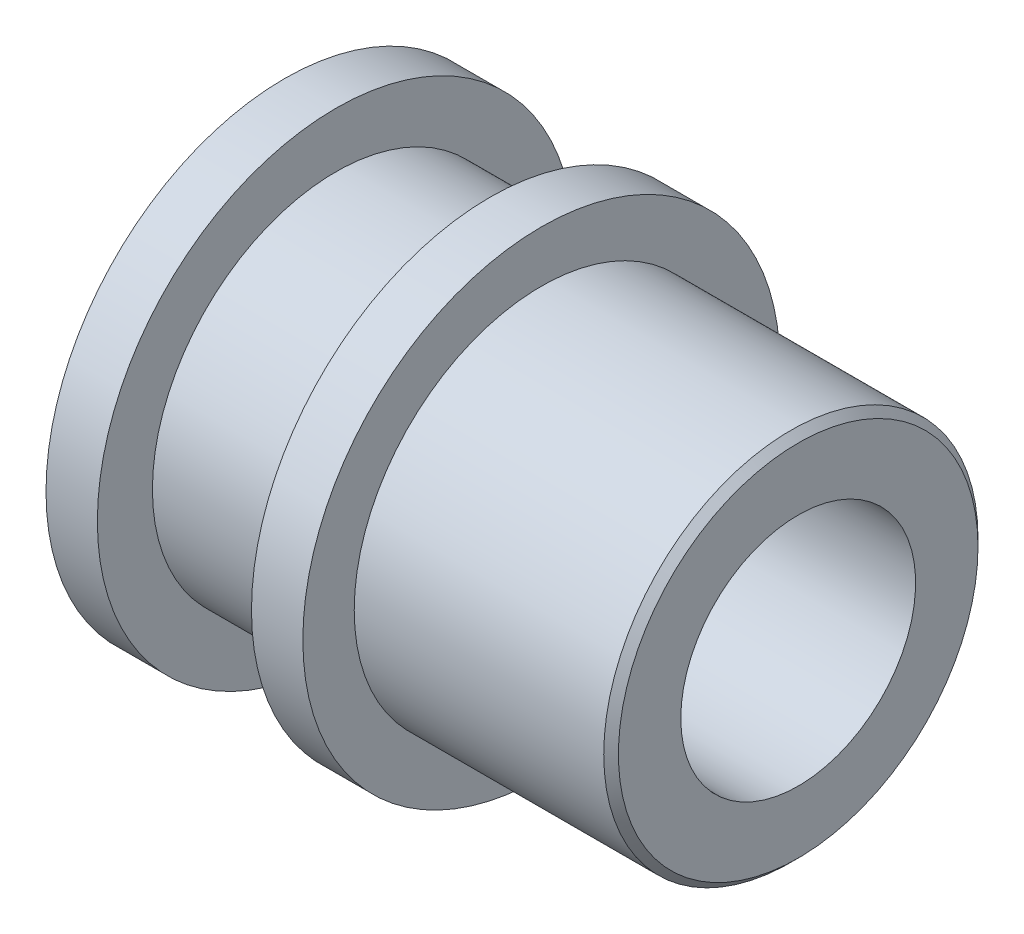
ISO-10303-21;
HEADER;
FILE_DESCRIPTION(('STEP AP214'),'2;1');
FILE_NAME('part.step','',(''),(''),'','','');
FILE_SCHEMA(('AUTOMOTIVE_DESIGN { 1 0 10303 214 1 1 1 1 }'));
ENDSEC;
DATA;
#1=APPLICATION_CONTEXT('core data for automotive mechanical design processes');
#2=APPLICATION_PROTOCOL_DEFINITION('international standard','automotive_design',2000,#1);
#3=PRODUCT_CONTEXT('',#1,'mechanical');
#4=PRODUCT('Part','Part','',(#3));
#5=PRODUCT_RELATED_PRODUCT_CATEGORY('part','',(#4));
#6=PRODUCT_DEFINITION_FORMATION('','',#4);
#7=PRODUCT_DEFINITION_CONTEXT('part definition',#1,'design');
#8=PRODUCT_DEFINITION('design','',#6,#7);
#9=PRODUCT_DEFINITION_SHAPE('','',#8);
#10=(LENGTH_UNIT() NAMED_UNIT(*) SI_UNIT(.MILLI.,.METRE.));
#11=(NAMED_UNIT(*) PLANE_ANGLE_UNIT() SI_UNIT($,.RADIAN.));
#12=(NAMED_UNIT(*) SI_UNIT($,.STERADIAN.) SOLID_ANGLE_UNIT());
#13=UNCERTAINTY_MEASURE_WITH_UNIT(LENGTH_MEASURE(1.E-05),#10,'distance_accuracy_value','');
#14=(GEOMETRIC_REPRESENTATION_CONTEXT(3) GLOBAL_UNCERTAINTY_ASSIGNED_CONTEXT((#13)) GLOBAL_UNIT_ASSIGNED_CONTEXT((#10,
#11,#12)) REPRESENTATION_CONTEXT('',''));
#15=CARTESIAN_POINT('',(0.,0.,0.));
#16=DIRECTION('',(0.,0.,1.));
#17=DIRECTION('',(1.,0.,0.));
#18=AXIS2_PLACEMENT_3D('',#15,#16,#17);
#19=CARTESIAN_POINT('',(0.,0.,0.));
#20=DIRECTION('',(-1.,0.,0.));
#21=DIRECTION('',(0.,0.,1.));
#22=AXIS2_PLACEMENT_3D('',#19,#20,#21);
#23=PLANE('',#22);
#24=CARTESIAN_POINT('',(0.,0.,0.));
#25=DIRECTION('',(-1.,0.,0.));
#26=DIRECTION('',(0.,0.,1.));
#27=AXIS2_PLACEMENT_3D('',#24,#25,#26);
#28=CIRCLE('',#27,26.5);
#29=CARTESIAN_POINT('',(0.,0.,26.5));
#30=VERTEX_POINT('',#29);
#31=EDGE_CURVE('E70',#30,#30,#28,.T.);
#32=ORIENTED_EDGE('',*,*,#31,.F.);
#33=EDGE_LOOP('',(#32));
#34=FACE_BOUND('',#33,.T.);
#35=CARTESIAN_POINT('',(0.,0.,0.));
#36=DIRECTION('',(-1.,0.,0.));
#37=DIRECTION('',(0.,0.,1.));
#38=AXIS2_PLACEMENT_3D('',#35,#36,#37);
#39=CIRCLE('',#38,32.5);
#40=CARTESIAN_POINT('',(0.,0.,32.5));
#41=VERTEX_POINT('',#40);
#42=EDGE_CURVE('E47',#41,#41,#39,.T.);
#43=ORIENTED_EDGE('',*,*,#42,.T.);
#44=EDGE_LOOP('',(#43));
#45=FACE_BOUND('',#44,.T.);
#46=ADVANCED_FACE('F32',(#34,#45),#23,.T.);
#47=CARTESIAN_POINT('',(0.,0.,0.));
#48=DIRECTION('',(-1.,0.,0.));
#49=DIRECTION('',(0.,0.,1.));
#50=AXIS2_PLACEMENT_3D('',#47,#48,#49);
#51=CYLINDRICAL_SURFACE('',#50,32.5);
#52=CARTESIAN_POINT('',(7.00000000000001,0.,0.));
#53=DIRECTION('',(-1.,0.,0.));
#54=DIRECTION('',(0.,0.,1.));
#55=AXIS2_PLACEMENT_3D('',#52,#53,#54);
#56=CIRCLE('',#55,32.5);
#57=CARTESIAN_POINT('',(7.00000000000001,0.,32.5));
#58=VERTEX_POINT('',#57);
#59=EDGE_CURVE('E52',#58,#58,#56,.T.);
#60=ORIENTED_EDGE('',*,*,#59,.T.);
#61=EDGE_LOOP('',(#60));
#62=FACE_BOUND('',#61,.T.);
#63=ORIENTED_EDGE('',*,*,#42,.F.);
#64=EDGE_LOOP('',(#63));
#65=FACE_BOUND('',#64,.T.);
#66=ADVANCED_FACE('F101',(#62,#65),#51,.T.);
#67=CARTESIAN_POINT('',(7.00000000000001,0.,32.5));
#68=DIRECTION('',(1.,0.,0.));
#69=DIRECTION('',(0.,0.,-1.));
#70=AXIS2_PLACEMENT_3D('',#67,#68,#69);
#71=PLANE('',#70);
#72=CARTESIAN_POINT('',(7.00000000000001,0.,0.));
#73=DIRECTION('',(-1.,0.,0.));
#74=DIRECTION('',(0.,0.,1.));
#75=AXIS2_PLACEMENT_3D('',#72,#73,#74);
#76=CIRCLE('',#75,25.);
#77=CARTESIAN_POINT('',(7.00000000000001,0.,25.));
#78=VERTEX_POINT('',#77);
#79=EDGE_CURVE('E55',#78,#78,#76,.T.);
#80=ORIENTED_EDGE('',*,*,#79,.T.);
#81=EDGE_LOOP('',(#80));
#82=FACE_BOUND('',#81,.T.);
#83=ORIENTED_EDGE('',*,*,#59,.F.);
#84=EDGE_LOOP('',(#83));
#85=FACE_BOUND('',#84,.T.);
#86=ADVANCED_FACE('F106',(#82,#85),#71,.T.);
#87=CARTESIAN_POINT('',(0.,0.,0.));
#88=DIRECTION('',(-1.,0.,0.));
#89=DIRECTION('',(0.,0.,1.));
#90=AXIS2_PLACEMENT_3D('',#87,#88,#89);
#91=CYLINDRICAL_SURFACE('',#90,25.);
#92=CARTESIAN_POINT('',(28.,0.,0.));
#93=DIRECTION('',(-1.,0.,0.));
#94=DIRECTION('',(0.,0.,1.));
#95=AXIS2_PLACEMENT_3D('',#92,#93,#94);
#96=CIRCLE('',#95,25.);
#97=CARTESIAN_POINT('',(28.,0.,25.));
#98=VERTEX_POINT('',#97);
#99=EDGE_CURVE('E58',#98,#98,#96,.T.);
#100=ORIENTED_EDGE('',*,*,#99,.T.);
#101=EDGE_LOOP('',(#100));
#102=FACE_BOUND('',#101,.T.);
#103=ORIENTED_EDGE('',*,*,#79,.F.);
#104=EDGE_LOOP('',(#103));
#105=FACE_BOUND('',#104,.T.);
#106=ADVANCED_FACE('F114',(#102,#105),#91,.T.);
#107=CARTESIAN_POINT('',(28.,0.,25.));
#108=DIRECTION('',(-1.,0.,0.));
#109=DIRECTION('',(0.,0.,1.));
#110=AXIS2_PLACEMENT_3D('',#107,#108,#109);
#111=PLANE('',#110);
#112=CARTESIAN_POINT('',(28.,0.,0.));
#113=DIRECTION('',(-1.,0.,0.));
#114=DIRECTION('',(0.,0.,1.));
#115=AXIS2_PLACEMENT_3D('',#112,#113,#114);
#116=CIRCLE('',#115,32.5);
#117=CARTESIAN_POINT('',(28.,0.,32.5));
#118=VERTEX_POINT('',#117);
#119=EDGE_CURVE('E61',#118,#118,#116,.T.);
#120=ORIENTED_EDGE('',*,*,#119,.T.);
#121=EDGE_LOOP('',(#120));
#122=FACE_BOUND('',#121,.T.);
#123=ORIENTED_EDGE('',*,*,#99,.F.);
#124=EDGE_LOOP('',(#123));
#125=FACE_BOUND('',#124,.T.);
#126=ADVANCED_FACE('F118',(#122,#125),#111,.T.);
#127=CARTESIAN_POINT('',(0.,0.,0.));
#128=DIRECTION('',(-1.,0.,0.));
#129=DIRECTION('',(0.,0.,1.));
#130=AXIS2_PLACEMENT_3D('',#127,#128,#129);
#131=CYLINDRICAL_SURFACE('',#130,32.5);
#132=CARTESIAN_POINT('',(35.,0.,0.));
#133=DIRECTION('',(-1.,0.,0.));
#134=DIRECTION('',(0.,0.,1.));
#135=AXIS2_PLACEMENT_3D('',#132,#133,#134);
#136=CIRCLE('',#135,32.5);
#137=CARTESIAN_POINT('',(35.,0.,32.5));
#138=VERTEX_POINT('',#137);
#139=EDGE_CURVE('E64',#138,#138,#136,.T.);
#140=ORIENTED_EDGE('',*,*,#139,.T.);
#141=EDGE_LOOP('',(#140));
#142=FACE_BOUND('',#141,.T.);
#143=ORIENTED_EDGE('',*,*,#119,.F.);
#144=EDGE_LOOP('',(#143));
#145=FACE_BOUND('',#144,.T.);
#146=ADVANCED_FACE('F122',(#142,#145),#131,.T.);
#147=CARTESIAN_POINT('',(35.,0.,32.5));
#148=DIRECTION('',(1.,0.,0.));
#149=DIRECTION('',(0.,0.,-1.));
#150=AXIS2_PLACEMENT_3D('',#147,#148,#149);
#151=PLANE('',#150);
#152=CARTESIAN_POINT('',(35.,0.,0.));
#153=DIRECTION('',(-1.,0.,0.));
#154=DIRECTION('',(0.,0.,1.));
#155=AXIS2_PLACEMENT_3D('',#152,#153,#154);
#156=CIRCLE('',#155,25.5);
#157=CARTESIAN_POINT('',(35.,0.,25.5));
#158=VERTEX_POINT('',#157);
#159=EDGE_CURVE('E67',#158,#158,#156,.T.);
#160=ORIENTED_EDGE('',*,*,#159,.T.);
#161=EDGE_LOOP('',(#160));
#162=FACE_BOUND('',#161,.T.);
#163=ORIENTED_EDGE('',*,*,#139,.F.);
#164=EDGE_LOOP('',(#163));
#165=FACE_BOUND('',#164,.T.);
#166=ADVANCED_FACE('F126',(#162,#165),#151,.T.);
#167=CARTESIAN_POINT('',(0.,0.,0.));
#168=DIRECTION('',(-1.,0.,0.));
#169=DIRECTION('',(0.,0.,1.));
#170=AXIS2_PLACEMENT_3D('',#167,#168,#169);
#171=CYLINDRICAL_SURFACE('',#170,25.5);
#172=CARTESIAN_POINT('',(69.,0.,0.));
#173=DIRECTION('',(1.,0.,0.));
#174=DIRECTION('',(0.,0.,-1.));
#175=AXIS2_PLACEMENT_3D('',#172,#173,#174);
#176=CIRCLE('',#175,25.5);
#177=CARTESIAN_POINT('',(69.,0.,-25.5));
#178=VERTEX_POINT('',#177);
#179=EDGE_CURVE('E39',#178,#178,#176,.F.);
#180=ORIENTED_EDGE('',*,*,#179,.T.);
#181=EDGE_LOOP('',(#180));
#182=FACE_BOUND('',#181,.T.);
#183=ORIENTED_EDGE('',*,*,#159,.F.);
#184=EDGE_LOOP('',(#183));
#185=FACE_BOUND('',#184,.T.);
#186=ADVANCED_FACE('F130',(#182,#185),#171,.T.);
#187=CARTESIAN_POINT('',(70.,0.,25.5));
#188=DIRECTION('',(1.,0.,0.));
#189=DIRECTION('',(0.,0.,-1.));
#190=AXIS2_PLACEMENT_3D('',#187,#188,#189);
#191=PLANE('',#190);
#192=CARTESIAN_POINT('',(70.,0.,0.));
#193=DIRECTION('',(1.,0.,0.));
#194=DIRECTION('',(0.,0.,-1.));
#195=AXIS2_PLACEMENT_3D('',#192,#193,#194);
#196=CIRCLE('',#195,24.5);
#197=CARTESIAN_POINT('',(70.,0.,-24.5));
#198=VERTEX_POINT('',#197);
#199=EDGE_CURVE('E10',#198,#198,#196,.T.);
#200=ORIENTED_EDGE('',*,*,#199,.T.);
#201=EDGE_LOOP('',(#200));
#202=FACE_BOUND('',#201,.T.);
#203=CARTESIAN_POINT('',(70.,0.,0.));
#204=DIRECTION('',(-1.,0.,0.));
#205=DIRECTION('',(0.,0.,1.));
#206=AXIS2_PLACEMENT_3D('',#203,#204,#205);
#207=CIRCLE('',#206,16.);
#208=CARTESIAN_POINT('',(70.,0.,16.));
#209=VERTEX_POINT('',#208);
#210=EDGE_CURVE('E73',#209,#209,#207,.T.);
#211=ORIENTED_EDGE('',*,*,#210,.T.);
#212=EDGE_LOOP('',(#211));
#213=FACE_BOUND('',#212,.T.);
#214=ADVANCED_FACE('F80',(#202,#213),#191,.T.);
#215=CARTESIAN_POINT('',(2.,0.,0.));
#216=DIRECTION('',(-1.,0.,0.));
#217=DIRECTION('',(0.,0.,1.));
#218=AXIS2_PLACEMENT_3D('',#215,#216,#217);
#219=PLANE('',#218);
#220=CARTESIAN_POINT('',(2.,0.,0.));
#221=DIRECTION('',(-1.,0.,0.));
#222=DIRECTION('',(0.,0.,1.));
#223=AXIS2_PLACEMENT_3D('',#220,#221,#222);
#224=CIRCLE('',#223,16.);
#225=CARTESIAN_POINT('',(2.,0.,16.));
#226=VERTEX_POINT('',#225);
#227=EDGE_CURVE('E74',#226,#226,#224,.T.);
#228=ORIENTED_EDGE('',*,*,#227,.F.);
#229=EDGE_LOOP('',(#228));
#230=FACE_BOUND('',#229,.T.);
#231=CARTESIAN_POINT('',(2.,0.,0.));
#232=DIRECTION('',(-1.,0.,0.));
#233=DIRECTION('',(0.,0.,1.));
#234=AXIS2_PLACEMENT_3D('',#231,#232,#233);
#235=CIRCLE('',#234,24.5);
#236=CARTESIAN_POINT('',(2.,0.,24.5));
#237=VERTEX_POINT('',#236);
#238=EDGE_CURVE('E43',#237,#237,#235,.T.);
#239=ORIENTED_EDGE('',*,*,#238,.T.);
#240=EDGE_LOOP('',(#239));
#241=FACE_BOUND('',#240,.T.);
#242=ADVANCED_FACE('F89',(#230,#241),#219,.T.);
#243=CARTESIAN_POINT('',(2.,0.,0.));
#244=DIRECTION('',(-1.,0.,0.));
#245=DIRECTION('',(0.,0.,1.));
#246=AXIS2_PLACEMENT_3D('',#243,#244,#245);
#247=CONICAL_SURFACE('',#246,24.5,0.785398163397455);
#248=ORIENTED_EDGE('',*,*,#31,.T.);
#249=EDGE_LOOP('',(#248));
#250=FACE_BOUND('',#249,.T.);
#251=ORIENTED_EDGE('',*,*,#238,.F.);
#252=EDGE_LOOP('',(#251));
#253=FACE_BOUND('',#252,.T.);
#254=ADVANCED_FACE('F85',(#250,#253),#247,.F.);
#255=CARTESIAN_POINT('',(70.,0.,0.));
#256=DIRECTION('',(-1.,0.,0.));
#257=DIRECTION('',(0.,0.,1.));
#258=AXIS2_PLACEMENT_3D('',#255,#256,#257);
#259=CYLINDRICAL_SURFACE('',#258,16.);
#260=ORIENTED_EDGE('',*,*,#210,.F.);
#261=EDGE_LOOP('',(#260));
#262=FACE_BOUND('',#261,.T.);
#263=ORIENTED_EDGE('',*,*,#227,.T.);
#264=EDGE_LOOP('',(#263));
#265=FACE_BOUND('',#264,.T.);
#266=ADVANCED_FACE('F82',(#262,#265),#259,.F.);
#267=CARTESIAN_POINT('',(69.,0.,0.));
#268=DIRECTION('',(-1.,0.,0.));
#269=DIRECTION('',(0.,0.,1.));
#270=AXIS2_PLACEMENT_3D('',#267,#268,#269);
#271=CONICAL_SURFACE('',#270,25.5,0.78539816339744);
#272=ORIENTED_EDGE('',*,*,#199,.F.);
#273=EDGE_LOOP('',(#272));
#274=FACE_BOUND('',#273,.T.);
#275=ORIENTED_EDGE('',*,*,#179,.F.);
#276=EDGE_LOOP('',(#275));
#277=FACE_BOUND('',#276,.T.);
#278=ADVANCED_FACE('F34',(#274,#277),#271,.T.);
#279=CLOSED_SHELL('',(#46,#66,#86,#106,#126,#146,#166,#186,#214,#242,#254,#266,#278));
#280=MANIFOLD_SOLID_BREP('B2',#279);
#281=ADVANCED_BREP_SHAPE_REPRESENTATION('',(#18,#280),#14);
#282=SHAPE_DEFINITION_REPRESENTATION(#9,#281);
ENDSEC;
END-ISO-10303-21;
